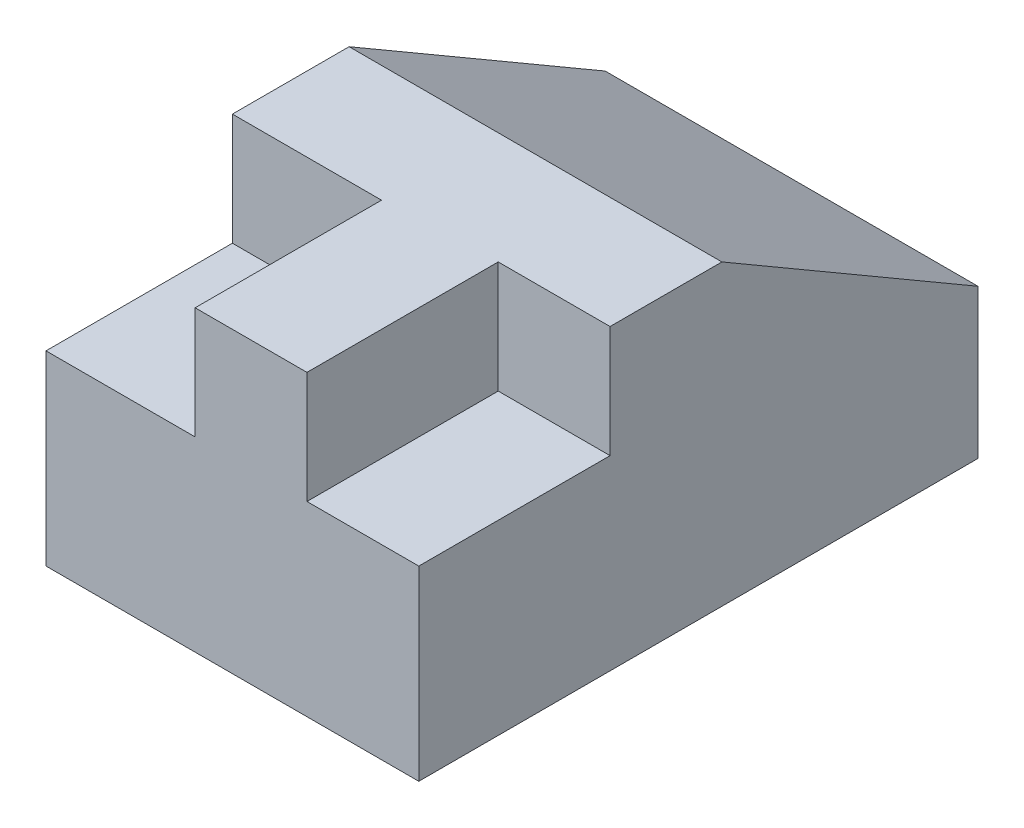
ISO-10303-21;
HEADER;
FILE_DESCRIPTION(('STEP AP214'),'2;1');
FILE_NAME('part.step','',(''),(''),'','','');
FILE_SCHEMA(('AUTOMOTIVE_DESIGN { 1 0 10303 214 1 1 1 1 }'));
ENDSEC;
DATA;
#1=APPLICATION_CONTEXT('core data for automotive mechanical design processes');
#2=APPLICATION_PROTOCOL_DEFINITION('international standard','automotive_design',2000,#1);
#3=PRODUCT_CONTEXT('',#1,'mechanical');
#4=PRODUCT('Part','Part','',(#3));
#5=PRODUCT_RELATED_PRODUCT_CATEGORY('part','',(#4));
#6=PRODUCT_DEFINITION_FORMATION('','',#4);
#7=PRODUCT_DEFINITION_CONTEXT('part definition',#1,'design');
#8=PRODUCT_DEFINITION('design','',#6,#7);
#9=PRODUCT_DEFINITION_SHAPE('','',#8);
#10=(LENGTH_UNIT() NAMED_UNIT(*) SI_UNIT(.MILLI.,.METRE.));
#11=(NAMED_UNIT(*) PLANE_ANGLE_UNIT() SI_UNIT($,.RADIAN.));
#12=(NAMED_UNIT(*) SI_UNIT($,.STERADIAN.) SOLID_ANGLE_UNIT());
#13=UNCERTAINTY_MEASURE_WITH_UNIT(LENGTH_MEASURE(1.E-05),#10,'distance_accuracy_value','');
#14=(GEOMETRIC_REPRESENTATION_CONTEXT(3) GLOBAL_UNCERTAINTY_ASSIGNED_CONTEXT((#13)) GLOBAL_UNIT_ASSIGNED_CONTEXT((#10,
#11,#12)) REPRESENTATION_CONTEXT('',''));
#15=CARTESIAN_POINT('',(0.,0.,0.));
#16=DIRECTION('',(0.,0.,1.));
#17=DIRECTION('',(1.,0.,0.));
#18=AXIS2_PLACEMENT_3D('',#15,#16,#17);
#19=CARTESIAN_POINT('',(50.,80.,75.));
#20=DIRECTION('',(0.,0.,-1.));
#21=DIRECTION('',(-1.,0.,0.));
#22=AXIS2_PLACEMENT_3D('',#19,#20,#21);
#23=PLANE('',#22);
#24=DIRECTION('',(1.,0.,0.));
#25=VECTOR('',#24,1.);
#26=CARTESIAN_POINT('',(50.,80.,75.));
#27=LINE('',#26,#25);
#28=CARTESIAN_POINT('',(-10.,80.,75.));
#29=VERTEX_POINT('',#28);
#30=CARTESIAN_POINT('',(20.,80.,75.));
#31=VERTEX_POINT('',#30);
#32=EDGE_CURVE('E185',#29,#31,#27,.T.);
#33=ORIENTED_EDGE('',*,*,#32,.F.);
#34=DIRECTION('',(0.,1.,0.));
#35=VECTOR('',#34,1.);
#36=CARTESIAN_POINT('',(-10.,50.,75.));
#37=LINE('',#36,#35);
#38=CARTESIAN_POINT('',(-10.,50.,75.));
#39=VERTEX_POINT('',#38);
#40=EDGE_CURVE('E146',#39,#29,#37,.T.);
#41=ORIENTED_EDGE('',*,*,#40,.F.);
#42=DIRECTION('',(1.,0.,0.));
#43=VECTOR('',#42,1.);
#44=CARTESIAN_POINT('',(-50.,50.,75.));
#45=LINE('',#44,#43);
#46=CARTESIAN_POINT('',(-50.,50.,75.));
#47=VERTEX_POINT('',#46);
#48=EDGE_CURVE('E133',#47,#39,#45,.T.);
#49=ORIENTED_EDGE('',*,*,#48,.F.);
#50=DIRECTION('',(0.,-1.,0.));
#51=VECTOR('',#50,1.);
#52=CARTESIAN_POINT('',(-50.,80.,75.));
#53=LINE('',#52,#51);
#54=CARTESIAN_POINT('',(-50.,0.,75.));
#55=VERTEX_POINT('',#54);
#56=EDGE_CURVE('E144',#47,#55,#53,.T.);
#57=ORIENTED_EDGE('',*,*,#56,.T.);
#58=DIRECTION('',(1.,0.,0.));
#59=VECTOR('',#58,1.);
#60=CARTESIAN_POINT('',(50.,0.,75.));
#61=LINE('',#60,#59);
#62=CARTESIAN_POINT('',(50.,0.,75.));
#63=VERTEX_POINT('',#62);
#64=EDGE_CURVE('E177',#55,#63,#61,.T.);
#65=ORIENTED_EDGE('',*,*,#64,.T.);
#66=DIRECTION('',(0.,-1.,0.));
#67=VECTOR('',#66,1.);
#68=CARTESIAN_POINT('',(50.,80.,75.));
#69=LINE('',#68,#67);
#70=CARTESIAN_POINT('',(50.,50.,75.));
#71=VERTEX_POINT('',#70);
#72=EDGE_CURVE('E154',#71,#63,#69,.T.);
#73=ORIENTED_EDGE('',*,*,#72,.F.);
#74=DIRECTION('',(-1.,0.,0.));
#75=VECTOR('',#74,1.);
#76=CARTESIAN_POINT('',(50.000012,50.,75.));
#77=LINE('',#76,#75);
#78=CARTESIAN_POINT('',(20.,50.,75.));
#79=VERTEX_POINT('',#78);
#80=EDGE_CURVE('E211',#71,#79,#77,.T.);
#81=ORIENTED_EDGE('',*,*,#80,.T.);
#82=DIRECTION('',(0.,-1.,0.));
#83=VECTOR('',#82,1.);
#84=CARTESIAN_POINT('',(20.,0.,75.));
#85=LINE('',#84,#83);
#86=EDGE_CURVE('E215',#31,#79,#85,.T.);
#87=ORIENTED_EDGE('',*,*,#86,.F.);
#88=EDGE_LOOP('',(#33,#41,#49,#57,#65,#73,#81,#87));
#89=FACE_BOUND('',#88,.T.);
#90=ADVANCED_FACE('F45',(#89),#23,.F.);
#91=CARTESIAN_POINT('',(50.,80.,75.));
#92=DIRECTION('',(-1.,0.,0.));
#93=DIRECTION('',(0.,0.,1.));
#94=AXIS2_PLACEMENT_3D('',#91,#92,#93);
#95=PLANE('',#94);
#96=DIRECTION('',(0.,0.,-1.));
#97=VECTOR('',#96,1.);
#98=CARTESIAN_POINT('',(50.,50.,75.));
#99=LINE('',#98,#97);
#100=CARTESIAN_POINT('',(50.,50.,23.6959190168058));
#101=VERTEX_POINT('',#100);
#102=EDGE_CURVE('E11',#71,#101,#99,.T.);
#103=ORIENTED_EDGE('',*,*,#102,.F.);
#104=ORIENTED_EDGE('',*,*,#72,.T.);
#105=DIRECTION('',(0.,0.,-1.));
#106=VECTOR('',#105,1.);
#107=CARTESIAN_POINT('',(50.,0.,75.));
#108=LINE('',#107,#106);
#109=CARTESIAN_POINT('',(50.,0.,-75.));
#110=VERTEX_POINT('',#109);
#111=EDGE_CURVE('E173',#63,#110,#108,.T.);
#112=ORIENTED_EDGE('',*,*,#111,.T.);
#113=DIRECTION('',(0.,-1.,0.));
#114=VECTOR('',#113,1.);
#115=CARTESIAN_POINT('',(50.,80.,-75.));
#116=LINE('',#115,#114);
#117=CARTESIAN_POINT('',(50.,40.,-75.));
#118=VERTEX_POINT('',#117);
#119=EDGE_CURVE('E159',#118,#110,#116,.T.);
#120=ORIENTED_EDGE('',*,*,#119,.F.);
#121=DIRECTION('',(0.,-0.503189268974055,-0.864176231789186));
#122=VECTOR('',#121,1.);
#123=CARTESIAN_POINT('',(50.,62.4853378589808,-36.3837262843485));
#124=LINE('',#123,#122);
#125=CARTESIAN_POINT('',(50.,80.,-6.30408098319421));
#126=VERTEX_POINT('',#125);
#127=EDGE_CURVE('E199',#126,#118,#124,.T.);
#128=ORIENTED_EDGE('',*,*,#127,.F.);
#129=DIRECTION('',(0.,0.,-1.));
#130=VECTOR('',#129,1.);
#131=CARTESIAN_POINT('',(50.,80.,75.));
#132=LINE('',#131,#130);
#133=CARTESIAN_POINT('',(50.,80.,23.6959190168058));
#134=VERTEX_POINT('',#133);
#135=EDGE_CURVE('E167',#134,#126,#132,.T.);
#136=ORIENTED_EDGE('',*,*,#135,.F.);
#137=DIRECTION('',(0.,1.,0.));
#138=VECTOR('',#137,1.);
#139=CARTESIAN_POINT('',(50.,80.,23.6959190168058));
#140=LINE('',#139,#138);
#141=EDGE_CURVE('E202',#101,#134,#140,.T.);
#142=ORIENTED_EDGE('',*,*,#141,.F.);
#143=EDGE_LOOP('',(#103,#104,#112,#120,#128,#136,#142));
#144=FACE_BOUND('',#143,.T.);
#145=ADVANCED_FACE('F260',(#144),#95,.F.);
#146=CARTESIAN_POINT('',(0.,80.,0.));
#147=DIRECTION('',(0.,1.,0.));
#148=DIRECTION('',(0.,0.,1.));
#149=AXIS2_PLACEMENT_3D('',#146,#147,#148);
#150=PLANE('',#149);
#151=DIRECTION('',(-1.,0.,0.));
#152=VECTOR('',#151,1.);
#153=CARTESIAN_POINT('',(-10.,80.,25.));
#154=LINE('',#153,#152);
#155=CARTESIAN_POINT('',(-10.,80.,25.));
#156=VERTEX_POINT('',#155);
#157=CARTESIAN_POINT('',(-50.,80.,25.));
#158=VERTEX_POINT('',#157);
#159=EDGE_CURVE('E139',#156,#158,#154,.T.);
#160=ORIENTED_EDGE('',*,*,#159,.F.);
#161=DIRECTION('',(0.,0.,-1.));
#162=VECTOR('',#161,1.);
#163=CARTESIAN_POINT('',(-10.,80.,75.));
#164=LINE('',#163,#162);
#165=EDGE_CURVE('E237',#29,#156,#164,.T.);
#166=ORIENTED_EDGE('',*,*,#165,.F.);
#167=ORIENTED_EDGE('',*,*,#32,.T.);
#168=DIRECTION('',(0.,0.,1.));
#169=VECTOR('',#168,1.);
#170=CARTESIAN_POINT('',(20.,80.,0.));
#171=LINE('',#170,#169);
#172=CARTESIAN_POINT('',(20.,80.,23.6959190168058));
#173=VERTEX_POINT('',#172);
#174=EDGE_CURVE('E219',#173,#31,#171,.T.);
#175=ORIENTED_EDGE('',*,*,#174,.F.);
#176=DIRECTION('',(1.,0.,0.));
#177=VECTOR('',#176,1.);
#178=CARTESIAN_POINT('',(0.,80.,23.6959190168058));
#179=LINE('',#178,#177);
#180=EDGE_CURVE('E54',#173,#134,#179,.T.);
#181=ORIENTED_EDGE('',*,*,#180,.T.);
#182=ORIENTED_EDGE('',*,*,#135,.T.);
#183=DIRECTION('',(1.,0.,0.));
#184=VECTOR('',#183,1.);
#185=CARTESIAN_POINT('',(-50.,80.,-6.30408098319421));
#186=LINE('',#185,#184);
#187=CARTESIAN_POINT('',(-50.,80.,-6.30408098319421));
#188=VERTEX_POINT('',#187);
#189=EDGE_CURVE('E191',#188,#126,#186,.T.);
#190=ORIENTED_EDGE('',*,*,#189,.F.);
#191=DIRECTION('',(0.,0.,1.));
#192=VECTOR('',#191,1.);
#193=CARTESIAN_POINT('',(-50.,80.,75.));
#194=LINE('',#193,#192);
#195=EDGE_CURVE('E172',#188,#158,#194,.T.);
#196=ORIENTED_EDGE('',*,*,#195,.T.);
#197=EDGE_LOOP('',(#160,#166,#167,#175,#181,#182,#190,#196));
#198=FACE_BOUND('',#197,.T.);
#199=ADVANCED_FACE('F251',(#198),#150,.T.);
#200=CARTESIAN_POINT('',(-50.,80.,75.));
#201=DIRECTION('',(1.,0.,0.));
#202=DIRECTION('',(0.,0.,-1.));
#203=AXIS2_PLACEMENT_3D('',#200,#201,#202);
#204=PLANE('',#203);
#205=DIRECTION('',(0.,0.,1.));
#206=VECTOR('',#205,1.);
#207=CARTESIAN_POINT('',(-50.,50.,25.));
#208=LINE('',#207,#206);
#209=CARTESIAN_POINT('',(-50.,50.,25.));
#210=VERTEX_POINT('',#209);
#211=EDGE_CURVE('E130',#210,#47,#208,.T.);
#212=ORIENTED_EDGE('',*,*,#211,.F.);
#213=DIRECTION('',(0.,1.,0.));
#214=VECTOR('',#213,1.);
#215=CARTESIAN_POINT('',(-50.,50.,25.));
#216=LINE('',#215,#214);
#217=EDGE_CURVE('E227',#210,#158,#216,.T.);
#218=ORIENTED_EDGE('',*,*,#217,.T.);
#219=ORIENTED_EDGE('',*,*,#195,.F.);
#220=DIRECTION('',(0.,-0.503189268974055,-0.864176231789186));
#221=VECTOR('',#220,1.);
#222=CARTESIAN_POINT('',(-50.,62.4853378589808,-36.3837262843485));
#223=LINE('',#222,#221);
#224=CARTESIAN_POINT('',(-50.,40.,-75.));
#225=VERTEX_POINT('',#224);
#226=EDGE_CURVE('E195',#188,#225,#223,.T.);
#227=ORIENTED_EDGE('',*,*,#226,.T.);
#228=DIRECTION('',(0.,-1.,0.));
#229=VECTOR('',#228,1.);
#230=CARTESIAN_POINT('',(-50.,80.,-75.));
#231=LINE('',#230,#229);
#232=CARTESIAN_POINT('',(-50.,0.,-75.));
#233=VERTEX_POINT('',#232);
#234=EDGE_CURVE('E164',#225,#233,#231,.T.);
#235=ORIENTED_EDGE('',*,*,#234,.T.);
#236=DIRECTION('',(0.,0.,1.));
#237=VECTOR('',#236,1.);
#238=CARTESIAN_POINT('',(-50.,0.,75.));
#239=LINE('',#238,#237);
#240=EDGE_CURVE('E152',#233,#55,#239,.T.);
#241=ORIENTED_EDGE('',*,*,#240,.T.);
#242=ORIENTED_EDGE('',*,*,#56,.F.);
#243=EDGE_LOOP('',(#212,#218,#219,#227,#235,#241,#242));
#244=FACE_BOUND('',#243,.T.);
#245=ADVANCED_FACE('F47',(#244),#204,.F.);
#246=CARTESIAN_POINT('',(50.,80.,-75.));
#247=DIRECTION('',(0.,0.,1.));
#248=DIRECTION('',(1.,0.,0.));
#249=AXIS2_PLACEMENT_3D('',#246,#247,#248);
#250=PLANE('',#249);
#251=ORIENTED_EDGE('',*,*,#234,.F.);
#252=DIRECTION('',(1.,0.,0.));
#253=VECTOR('',#252,1.);
#254=CARTESIAN_POINT('',(-50.,40.,-75.));
#255=LINE('',#254,#253);
#256=EDGE_CURVE('E182',#225,#118,#255,.T.);
#257=ORIENTED_EDGE('',*,*,#256,.T.);
#258=ORIENTED_EDGE('',*,*,#119,.T.);
#259=DIRECTION('',(-1.,0.,0.));
#260=VECTOR('',#259,1.);
#261=CARTESIAN_POINT('',(50.,0.,-75.));
#262=LINE('',#261,#260);
#263=EDGE_CURVE('E168',#110,#233,#262,.T.);
#264=ORIENTED_EDGE('',*,*,#263,.T.);
#265=EDGE_LOOP('',(#251,#257,#258,#264));
#266=FACE_BOUND('',#265,.T.);
#267=ADVANCED_FACE('F266',(#266),#250,.F.);
#268=CARTESIAN_POINT('',(0.,0.,0.));
#269=DIRECTION('',(0.,1.,0.));
#270=DIRECTION('',(0.,0.,1.));
#271=AXIS2_PLACEMENT_3D('',#268,#269,#270);
#272=PLANE('',#271);
#273=ORIENTED_EDGE('',*,*,#240,.F.);
#274=ORIENTED_EDGE('',*,*,#263,.F.);
#275=ORIENTED_EDGE('',*,*,#111,.F.);
#276=ORIENTED_EDGE('',*,*,#64,.F.);
#277=EDGE_LOOP('',(#273,#274,#275,#276));
#278=FACE_BOUND('',#277,.T.);
#279=ADVANCED_FACE('F268',(#278),#272,.F.);
#280=CARTESIAN_POINT('',(-50.,62.4853378589808,-36.3837262843485));
#281=DIRECTION('',(0.,-0.864176231789185,0.503189268974055));
#282=DIRECTION('',(0.,-0.503189268974055,-0.864176231789185));
#283=AXIS2_PLACEMENT_3D('',#280,#281,#282);
#284=PLANE('',#283);
#285=ORIENTED_EDGE('',*,*,#127,.T.);
#286=ORIENTED_EDGE('',*,*,#256,.F.);
#287=ORIENTED_EDGE('',*,*,#226,.F.);
#288=ORIENTED_EDGE('',*,*,#189,.T.);
#289=EDGE_LOOP('',(#285,#286,#287,#288));
#290=FACE_BOUND('',#289,.T.);
#291=ADVANCED_FACE('F256',(#290),#284,.F.);
#292=CARTESIAN_POINT('',(50.000012,50.,0.));
#293=DIRECTION('',(0.,1.,0.));
#294=DIRECTION('',(0.,0.,1.));
#295=AXIS2_PLACEMENT_3D('',#292,#293,#294);
#296=PLANE('',#295);
#297=ORIENTED_EDGE('',*,*,#102,.T.);
#298=DIRECTION('',(-1.,0.,0.));
#299=VECTOR('',#298,1.);
#300=CARTESIAN_POINT('',(50.000012,50.,23.6959190168058));
#301=LINE('',#300,#299);
#302=CARTESIAN_POINT('',(20.,50.,23.6959190168058));
#303=VERTEX_POINT('',#302);
#304=EDGE_CURVE('E208',#101,#303,#301,.T.);
#305=ORIENTED_EDGE('',*,*,#304,.T.);
#306=DIRECTION('',(0.,0.,-1.));
#307=VECTOR('',#306,1.);
#308=CARTESIAN_POINT('',(20.,50.,0.));
#309=LINE('',#308,#307);
#310=EDGE_CURVE('E224',#79,#303,#309,.T.);
#311=ORIENTED_EDGE('',*,*,#310,.F.);
#312=ORIENTED_EDGE('',*,*,#80,.F.);
#313=EDGE_LOOP('',(#297,#305,#311,#312));
#314=FACE_BOUND('',#313,.T.);
#315=ADVANCED_FACE('F273',(#314),#296,.T.);
#316=CARTESIAN_POINT('',(50.000012,0.,23.6959190168058));
#317=DIRECTION('',(0.,0.,1.));
#318=DIRECTION('',(1.,0.,0.));
#319=AXIS2_PLACEMENT_3D('',#316,#317,#318);
#320=PLANE('',#319);
#321=ORIENTED_EDGE('',*,*,#141,.T.);
#322=ORIENTED_EDGE('',*,*,#180,.F.);
#323=DIRECTION('',(0.,1.,0.));
#324=VECTOR('',#323,1.);
#325=CARTESIAN_POINT('',(20.,0.,23.6959190168058));
#326=LINE('',#325,#324);
#327=EDGE_CURVE('E69',#303,#173,#326,.T.);
#328=ORIENTED_EDGE('',*,*,#327,.F.);
#329=ORIENTED_EDGE('',*,*,#304,.F.);
#330=EDGE_LOOP('',(#321,#322,#328,#329));
#331=FACE_BOUND('',#330,.T.);
#332=ADVANCED_FACE('F275',(#331),#320,.T.);
#333=CARTESIAN_POINT('',(20.,0.,0.));
#334=DIRECTION('',(1.,0.,0.));
#335=DIRECTION('',(0.,0.,-1.));
#336=AXIS2_PLACEMENT_3D('',#333,#334,#335);
#337=PLANE('',#336);
#338=ORIENTED_EDGE('',*,*,#310,.T.);
#339=ORIENTED_EDGE('',*,*,#327,.T.);
#340=ORIENTED_EDGE('',*,*,#174,.T.);
#341=ORIENTED_EDGE('',*,*,#86,.T.);
#342=EDGE_LOOP('',(#338,#339,#340,#341));
#343=FACE_BOUND('',#342,.T.);
#344=ADVANCED_FACE('F277',(#343),#337,.T.);
#345=CARTESIAN_POINT('',(-10.,50.,25.));
#346=DIRECTION('',(0.,0.,-1.));
#347=DIRECTION('',(-1.,0.,0.));
#348=AXIS2_PLACEMENT_3D('',#345,#346,#347);
#349=PLANE('',#348);
#350=ORIENTED_EDGE('',*,*,#159,.T.);
#351=ORIENTED_EDGE('',*,*,#217,.F.);
#352=DIRECTION('',(-1.,0.,0.));
#353=VECTOR('',#352,1.);
#354=CARTESIAN_POINT('',(-10.,50.,25.));
#355=LINE('',#354,#353);
#356=CARTESIAN_POINT('',(-10.,50.,25.));
#357=VERTEX_POINT('',#356);
#358=EDGE_CURVE('E61',#357,#210,#355,.T.);
#359=ORIENTED_EDGE('',*,*,#358,.F.);
#360=DIRECTION('',(0.,1.,0.));
#361=VECTOR('',#360,1.);
#362=CARTESIAN_POINT('',(-10.,50.,25.));
#363=LINE('',#362,#361);
#364=EDGE_CURVE('E230',#357,#156,#363,.T.);
#365=ORIENTED_EDGE('',*,*,#364,.T.);
#366=EDGE_LOOP('',(#350,#351,#359,#365));
#367=FACE_BOUND('',#366,.T.);
#368=ADVANCED_FACE('F246',(#367),#349,.F.);
#369=CARTESIAN_POINT('',(-10.,50.,75.));
#370=DIRECTION('',(1.,0.,0.));
#371=DIRECTION('',(0.,0.,-1.));
#372=AXIS2_PLACEMENT_3D('',#369,#370,#371);
#373=PLANE('',#372);
#374=ORIENTED_EDGE('',*,*,#165,.T.);
#375=ORIENTED_EDGE('',*,*,#364,.F.);
#376=DIRECTION('',(0.,0.,-1.));
#377=VECTOR('',#376,1.);
#378=CARTESIAN_POINT('',(-10.,50.,75.));
#379=LINE('',#378,#377);
#380=EDGE_CURVE('E148',#39,#357,#379,.T.);
#381=ORIENTED_EDGE('',*,*,#380,.F.);
#382=ORIENTED_EDGE('',*,*,#40,.T.);
#383=EDGE_LOOP('',(#374,#375,#381,#382));
#384=FACE_BOUND('',#383,.T.);
#385=ADVANCED_FACE('F278',(#384),#373,.F.);
#386=CARTESIAN_POINT('',(0.,50.,0.));
#387=DIRECTION('',(0.,1.,0.));
#388=DIRECTION('',(0.,0.,1.));
#389=AXIS2_PLACEMENT_3D('',#386,#387,#388);
#390=PLANE('',#389);
#391=ORIENTED_EDGE('',*,*,#211,.T.);
#392=ORIENTED_EDGE('',*,*,#48,.T.);
#393=ORIENTED_EDGE('',*,*,#380,.T.);
#394=ORIENTED_EDGE('',*,*,#358,.T.);
#395=EDGE_LOOP('',(#391,#392,#393,#394));
#396=FACE_BOUND('',#395,.T.);
#397=ADVANCED_FACE('F132',(#396),#390,.T.);
#398=CLOSED_SHELL('',(#90,#145,#199,#245,#267,#279,#291,#315,#332,#344,#368,#385,#397));
#399=MANIFOLD_SOLID_BREP('B2',#398);
#400=ADVANCED_BREP_SHAPE_REPRESENTATION('',(#18,#399),#14);
#401=SHAPE_DEFINITION_REPRESENTATION(#9,#400);
ENDSEC;
END-ISO-10303-21;
